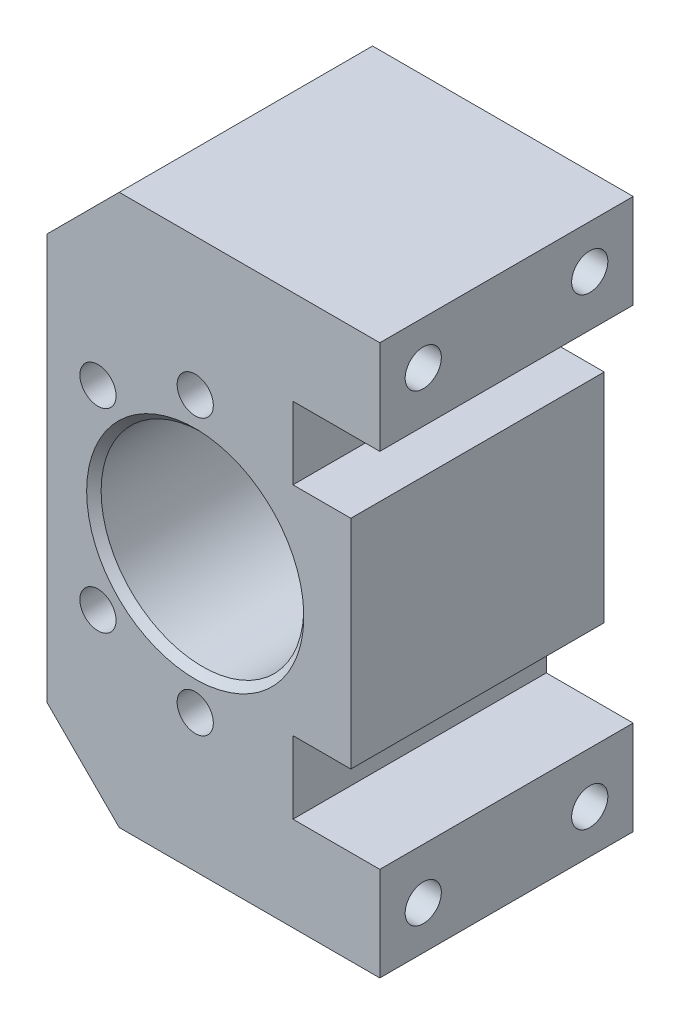
ISO-10303-21;
HEADER;
FILE_DESCRIPTION(('STEP AP214'),'2;1');
FILE_NAME('part.step','',(''),(''),'','','');
FILE_SCHEMA(('AUTOMOTIVE_DESIGN { 1 0 10303 214 1 1 1 1 }'));
ENDSEC;
DATA;
#1=APPLICATION_CONTEXT('core data for automotive mechanical design processes');
#2=APPLICATION_PROTOCOL_DEFINITION('international standard','automotive_design',2000,#1);
#3=PRODUCT_CONTEXT('',#1,'mechanical');
#4=PRODUCT('Part','Part','',(#3));
#5=PRODUCT_RELATED_PRODUCT_CATEGORY('part','',(#4));
#6=PRODUCT_DEFINITION_FORMATION('','',#4);
#7=PRODUCT_DEFINITION_CONTEXT('part definition',#1,'design');
#8=PRODUCT_DEFINITION('design','',#6,#7);
#9=PRODUCT_DEFINITION_SHAPE('','',#8);
#10=(LENGTH_UNIT() NAMED_UNIT(*) SI_UNIT(.MILLI.,.METRE.));
#11=(NAMED_UNIT(*) PLANE_ANGLE_UNIT() SI_UNIT($,.RADIAN.));
#12=(NAMED_UNIT(*) SI_UNIT($,.STERADIAN.) SOLID_ANGLE_UNIT());
#13=UNCERTAINTY_MEASURE_WITH_UNIT(LENGTH_MEASURE(1.E-05),#10,'distance_accuracy_value','');
#14=(GEOMETRIC_REPRESENTATION_CONTEXT(3) GLOBAL_UNCERTAINTY_ASSIGNED_CONTEXT((#13)) GLOBAL_UNIT_ASSIGNED_CONTEXT((#10,
#11,#12)) REPRESENTATION_CONTEXT('',''));
#15=CARTESIAN_POINT('',(0.,0.,0.));
#16=DIRECTION('',(0.,0.,1.));
#17=DIRECTION('',(1.,0.,0.));
#18=AXIS2_PLACEMENT_3D('',#15,#16,#17);
#19=CARTESIAN_POINT('',(46.,0.,35.));
#20=DIRECTION('',(-1.,0.,0.));
#21=DIRECTION('',(0.,0.,1.));
#22=AXIS2_PLACEMENT_3D('',#19,#20,#21);
#23=PLANE('',#22);
#24=CARTESIAN_POINT('',(46.,70.,6.));
#25=DIRECTION('',(1.,0.,0.));
#26=DIRECTION('',(0.,0.,-1.));
#27=AXIS2_PLACEMENT_3D('',#24,#25,#26);
#28=CIRCLE('',#27,2.49999999999999);
#29=CARTESIAN_POINT('',(46.,70.,3.50000000000001));
#30=VERTEX_POINT('',#29);
#31=EDGE_CURVE('E495',#30,#30,#28,.T.);
#32=ORIENTED_EDGE('',*,*,#31,.F.);
#33=EDGE_LOOP('',(#32));
#34=FACE_BOUND('',#33,.T.);
#35=CARTESIAN_POINT('',(46.,70.,29.));
#36=DIRECTION('',(1.,0.,0.));
#37=DIRECTION('',(0.,0.,-1.));
#38=AXIS2_PLACEMENT_3D('',#35,#36,#37);
#39=CIRCLE('',#38,2.49999999999999);
#40=CARTESIAN_POINT('',(46.,70.,26.5));
#41=VERTEX_POINT('',#40);
#42=EDGE_CURVE('E479',#41,#41,#39,.T.);
#43=ORIENTED_EDGE('',*,*,#42,.F.);
#44=EDGE_LOOP('',(#43));
#45=FACE_BOUND('',#44,.T.);
#46=DIRECTION('',(0.,1.,0.));
#47=VECTOR('',#46,1.);
#48=CARTESIAN_POINT('',(46.,0.,35.));
#49=LINE('',#48,#47);
#50=CARTESIAN_POINT('',(46.,63.,35.));
#51=VERTEX_POINT('',#50);
#52=CARTESIAN_POINT('',(46.,76.,35.));
#53=VERTEX_POINT('',#52);
#54=EDGE_CURVE('E172',#51,#53,#49,.T.);
#55=ORIENTED_EDGE('',*,*,#54,.F.);
#56=DIRECTION('',(0.,0.,-1.));
#57=VECTOR('',#56,1.);
#58=CARTESIAN_POINT('',(46.,63.,35.));
#59=LINE('',#58,#57);
#60=CARTESIAN_POINT('',(46.,63.,0.));
#61=VERTEX_POINT('',#60);
#62=EDGE_CURVE('E157',#51,#61,#59,.T.);
#63=ORIENTED_EDGE('',*,*,#62,.T.);
#64=DIRECTION('',(0.,1.,0.));
#65=VECTOR('',#64,1.);
#66=CARTESIAN_POINT('',(46.,0.,0.));
#67=LINE('',#66,#65);
#68=CARTESIAN_POINT('',(46.,76.,0.));
#69=VERTEX_POINT('',#68);
#70=EDGE_CURVE('E196',#61,#69,#67,.T.);
#71=ORIENTED_EDGE('',*,*,#70,.T.);
#72=DIRECTION('',(0.,0.,-1.));
#73=VECTOR('',#72,1.);
#74=CARTESIAN_POINT('',(46.,76.,35.));
#75=LINE('',#74,#73);
#76=EDGE_CURVE('E179',#53,#69,#75,.T.);
#77=ORIENTED_EDGE('',*,*,#76,.F.);
#78=EDGE_LOOP('',(#55,#63,#71,#77));
#79=FACE_BOUND('',#78,.T.);
#80=ADVANCED_FACE('F32',(#34,#45,#79),#23,.F.);
#81=CARTESIAN_POINT('',(0.,0.,35.));
#82=DIRECTION('',(0.,0.,-1.));
#83=DIRECTION('',(-1.,0.,0.));
#84=AXIS2_PLACEMENT_3D('',#81,#82,#83);
#85=PLANE('',#84);
#86=CARTESIAN_POINT('',(20.5,57.,35.));
#87=DIRECTION('',(0.,0.,1.));
#88=DIRECTION('',(1.,0.,0.));
#89=AXIS2_PLACEMENT_3D('',#86,#87,#88);
#90=CIRCLE('',#89,2.5);
#91=CARTESIAN_POINT('',(23.,57.,35.));
#92=VERTEX_POINT('',#91);
#93=EDGE_CURVE('E513',#92,#92,#90,.T.);
#94=ORIENTED_EDGE('',*,*,#93,.F.);
#95=EDGE_LOOP('',(#94));
#96=FACE_BOUND('',#95,.T.);
#97=CARTESIAN_POINT('',(7.06497115745557,51.4350288425443,35.));
#98=DIRECTION('',(0.,0.,1.));
#99=DIRECTION('',(1.,0.,0.));
#100=AXIS2_PLACEMENT_3D('',#97,#98,#99);
#101=CIRCLE('',#100,2.5);
#102=CARTESIAN_POINT('',(9.56497115745557,51.4350288425443,35.));
#103=VERTEX_POINT('',#102);
#104=EDGE_CURVE('E519',#103,#103,#101,.T.);
#105=ORIENTED_EDGE('',*,*,#104,.F.);
#106=EDGE_LOOP('',(#105));
#107=FACE_BOUND('',#106,.T.);
#108=CARTESIAN_POINT('',(7.06497115745557,24.5649711574556,35.));
#109=DIRECTION('',(0.,0.,1.));
#110=DIRECTION('',(1.,0.,0.));
#111=AXIS2_PLACEMENT_3D('',#108,#109,#110);
#112=CIRCLE('',#111,2.5);
#113=CARTESIAN_POINT('',(9.56497115745557,24.5649711574556,35.));
#114=VERTEX_POINT('',#113);
#115=EDGE_CURVE('E525',#114,#114,#112,.T.);
#116=ORIENTED_EDGE('',*,*,#115,.F.);
#117=EDGE_LOOP('',(#116));
#118=FACE_BOUND('',#117,.T.);
#119=CARTESIAN_POINT('',(20.5,19.,35.));
#120=DIRECTION('',(0.,0.,1.));
#121=DIRECTION('',(1.,0.,0.));
#122=AXIS2_PLACEMENT_3D('',#119,#120,#121);
#123=CIRCLE('',#122,2.5);
#124=CARTESIAN_POINT('',(23.,19.,35.));
#125=VERTEX_POINT('',#124);
#126=EDGE_CURVE('E531',#125,#125,#123,.T.);
#127=ORIENTED_EDGE('',*,*,#126,.F.);
#128=EDGE_LOOP('',(#127));
#129=FACE_BOUND('',#128,.T.);
#130=CARTESIAN_POINT('',(20.5,38.,35.));
#131=DIRECTION('',(0.,0.,-1.));
#132=DIRECTION('',(-1.,0.,0.));
#133=AXIS2_PLACEMENT_3D('',#130,#131,#132);
#134=CIRCLE('',#133,15.);
#135=CARTESIAN_POINT('',(5.49999999999998,38.,35.));
#136=VERTEX_POINT('',#135);
#137=EDGE_CURVE('E215',#136,#136,#134,.T.);
#138=ORIENTED_EDGE('',*,*,#137,.T.);
#139=EDGE_LOOP('',(#138));
#140=FACE_BOUND('',#139,.T.);
#141=DIRECTION('',(0.,1.,0.));
#142=VECTOR('',#141,1.);
#143=CARTESIAN_POINT('',(34.,63.,35.));
#144=LINE('',#143,#142);
#145=CARTESIAN_POINT('',(34.,53.,35.));
#146=VERTEX_POINT('',#145);
#147=CARTESIAN_POINT('',(34.,63.,35.));
#148=VERTEX_POINT('',#147);
#149=EDGE_CURVE('E168',#146,#148,#144,.T.);
#150=ORIENTED_EDGE('',*,*,#149,.T.);
#151=DIRECTION('',(1.,0.,0.));
#152=VECTOR('',#151,1.);
#153=CARTESIAN_POINT('',(46.,63.,35.));
#154=LINE('',#153,#152);
#155=EDGE_CURVE('E160',#148,#51,#154,.T.);
#156=ORIENTED_EDGE('',*,*,#155,.T.);
#157=ORIENTED_EDGE('',*,*,#54,.T.);
#158=DIRECTION('',(-1.,0.,0.));
#159=VECTOR('',#158,1.);
#160=CARTESIAN_POINT('',(0.,76.,35.));
#161=LINE('',#160,#159);
#162=CARTESIAN_POINT('',(10.,76.,35.));
#163=VERTEX_POINT('',#162);
#164=EDGE_CURVE('E184',#53,#163,#161,.T.);
#165=ORIENTED_EDGE('',*,*,#164,.T.);
#166=DIRECTION('',(0.707106781186548,0.707106781186547,0.));
#167=VECTOR('',#166,1.);
#168=CARTESIAN_POINT('',(0.,66.,35.));
#169=LINE('',#168,#167);
#170=CARTESIAN_POINT('',(0.,66.,35.));
#171=VERTEX_POINT('',#170);
#172=EDGE_CURVE('E230',#163,#171,#169,.F.);
#173=ORIENTED_EDGE('',*,*,#172,.T.);
#174=DIRECTION('',(0.,-1.,0.));
#175=VECTOR('',#174,1.);
#176=CARTESIAN_POINT('',(0.,0.,35.));
#177=LINE('',#176,#175);
#178=CARTESIAN_POINT('',(0.,10.,35.));
#179=VERTEX_POINT('',#178);
#180=EDGE_CURVE('E185',#171,#179,#177,.T.);
#181=ORIENTED_EDGE('',*,*,#180,.T.);
#182=DIRECTION('',(-0.707106781186546,0.707106781186549,0.));
#183=VECTOR('',#182,1.);
#184=CARTESIAN_POINT('',(9.99999999999998,0.,35.));
#185=LINE('',#184,#183);
#186=CARTESIAN_POINT('',(9.99999999999998,0.,35.));
#187=VERTEX_POINT('',#186);
#188=EDGE_CURVE('E40',#179,#187,#185,.F.);
#189=ORIENTED_EDGE('',*,*,#188,.T.);
#190=DIRECTION('',(1.,0.,0.));
#191=VECTOR('',#190,1.);
#192=CARTESIAN_POINT('',(0.,0.,35.));
#193=LINE('',#192,#191);
#194=CARTESIAN_POINT('',(46.,0.,35.));
#195=VERTEX_POINT('',#194);
#196=EDGE_CURVE('E181',#187,#195,#193,.T.);
#197=ORIENTED_EDGE('',*,*,#196,.T.);
#198=CARTESIAN_POINT('',(46.,13.,35.));
#199=VERTEX_POINT('',#198);
#200=EDGE_CURVE('E180',#195,#199,#49,.T.);
#201=ORIENTED_EDGE('',*,*,#200,.T.);
#202=DIRECTION('',(-1.,0.,0.));
#203=VECTOR('',#202,1.);
#204=CARTESIAN_POINT('',(34.,13.,35.));
#205=LINE('',#204,#203);
#206=CARTESIAN_POINT('',(34.,13.,35.));
#207=VERTEX_POINT('',#206);
#208=EDGE_CURVE('E47',#199,#207,#205,.T.);
#209=ORIENTED_EDGE('',*,*,#208,.T.);
#210=DIRECTION('',(0.,1.,0.));
#211=VECTOR('',#210,1.);
#212=CARTESIAN_POINT('',(34.,23.,35.));
#213=LINE('',#212,#211);
#214=CARTESIAN_POINT('',(34.,23.,35.));
#215=VERTEX_POINT('',#214);
#216=EDGE_CURVE('E567',#207,#215,#213,.T.);
#217=ORIENTED_EDGE('',*,*,#216,.T.);
#218=DIRECTION('',(1.,0.,0.));
#219=VECTOR('',#218,1.);
#220=CARTESIAN_POINT('',(42.,23.,35.));
#221=LINE('',#220,#219);
#222=CARTESIAN_POINT('',(42.,23.,35.));
#223=VERTEX_POINT('',#222);
#224=EDGE_CURVE('E569',#215,#223,#221,.T.);
#225=ORIENTED_EDGE('',*,*,#224,.T.);
#226=DIRECTION('',(0.,1.,0.));
#227=VECTOR('',#226,1.);
#228=CARTESIAN_POINT('',(42.,53.,35.));
#229=LINE('',#228,#227);
#230=CARTESIAN_POINT('',(42.,53.,35.));
#231=VERTEX_POINT('',#230);
#232=EDGE_CURVE('E573',#223,#231,#229,.T.);
#233=ORIENTED_EDGE('',*,*,#232,.T.);
#234=DIRECTION('',(-1.,0.,0.));
#235=VECTOR('',#234,1.);
#236=CARTESIAN_POINT('',(34.,53.,35.));
#237=LINE('',#236,#235);
#238=EDGE_CURVE('E576',#231,#146,#237,.T.);
#239=ORIENTED_EDGE('',*,*,#238,.T.);
#240=EDGE_LOOP('',(#150,#156,#157,#165,#173,#181,#189,#197,#201,#209,#217,#225,#233,#239));
#241=FACE_BOUND('',#240,.T.);
#242=ADVANCED_FACE('F171',(#96,#107,#118,#129,#140,#241),#85,.F.);
#243=CARTESIAN_POINT('',(0.,0.,0.));
#244=DIRECTION('',(0.,0.,-1.));
#245=DIRECTION('',(-1.,0.,0.));
#246=AXIS2_PLACEMENT_3D('',#243,#244,#245);
#247=PLANE('',#246);
#248=DIRECTION('',(1.,0.,0.));
#249=VECTOR('',#248,1.);
#250=CARTESIAN_POINT('',(46.,63.,0.));
#251=LINE('',#250,#249);
#252=CARTESIAN_POINT('',(34.,63.,0.));
#253=VERTEX_POINT('',#252);
#254=EDGE_CURVE('E163',#253,#61,#251,.T.);
#255=ORIENTED_EDGE('',*,*,#254,.F.);
#256=DIRECTION('',(0.,1.,0.));
#257=VECTOR('',#256,1.);
#258=CARTESIAN_POINT('',(34.,63.,0.));
#259=LINE('',#258,#257);
#260=CARTESIAN_POINT('',(34.,53.,0.));
#261=VERTEX_POINT('',#260);
#262=EDGE_CURVE('E176',#261,#253,#259,.T.);
#263=ORIENTED_EDGE('',*,*,#262,.F.);
#264=DIRECTION('',(-1.,0.,0.));
#265=VECTOR('',#264,1.);
#266=CARTESIAN_POINT('',(34.,53.,0.));
#267=LINE('',#266,#265);
#268=CARTESIAN_POINT('',(42.,53.,0.));
#269=VERTEX_POINT('',#268);
#270=EDGE_CURVE('E472',#269,#261,#267,.T.);
#271=ORIENTED_EDGE('',*,*,#270,.F.);
#272=DIRECTION('',(0.,1.,0.));
#273=VECTOR('',#272,1.);
#274=CARTESIAN_POINT('',(42.,53.,0.));
#275=LINE('',#274,#273);
#276=CARTESIAN_POINT('',(42.,23.,0.));
#277=VERTEX_POINT('',#276);
#278=EDGE_CURVE('E466',#277,#269,#275,.T.);
#279=ORIENTED_EDGE('',*,*,#278,.F.);
#280=DIRECTION('',(1.,0.,0.));
#281=VECTOR('',#280,1.);
#282=CARTESIAN_POINT('',(42.,23.,0.));
#283=LINE('',#282,#281);
#284=CARTESIAN_POINT('',(34.,23.,0.));
#285=VERTEX_POINT('',#284);
#286=EDGE_CURVE('E464',#285,#277,#283,.T.);
#287=ORIENTED_EDGE('',*,*,#286,.F.);
#288=DIRECTION('',(0.,1.,0.));
#289=VECTOR('',#288,1.);
#290=CARTESIAN_POINT('',(34.,23.,0.));
#291=LINE('',#290,#289);
#292=CARTESIAN_POINT('',(34.,13.,0.));
#293=VERTEX_POINT('',#292);
#294=EDGE_CURVE('E458',#293,#285,#291,.T.);
#295=ORIENTED_EDGE('',*,*,#294,.F.);
#296=DIRECTION('',(-1.,0.,0.));
#297=VECTOR('',#296,1.);
#298=CARTESIAN_POINT('',(34.,13.,0.));
#299=LINE('',#298,#297);
#300=CARTESIAN_POINT('',(46.,13.,0.));
#301=VERTEX_POINT('',#300);
#302=EDGE_CURVE('E454',#301,#293,#299,.T.);
#303=ORIENTED_EDGE('',*,*,#302,.F.);
#304=CARTESIAN_POINT('',(46.,0.,0.));
#305=VERTEX_POINT('',#304);
#306=EDGE_CURVE('E197',#305,#301,#67,.T.);
#307=ORIENTED_EDGE('',*,*,#306,.F.);
#308=DIRECTION('',(1.,0.,0.));
#309=VECTOR('',#308,1.);
#310=CARTESIAN_POINT('',(0.,0.,0.));
#311=LINE('',#310,#309);
#312=CARTESIAN_POINT('',(9.99999999999998,0.,0.));
#313=VERTEX_POINT('',#312);
#314=EDGE_CURVE('E193',#313,#305,#311,.T.);
#315=ORIENTED_EDGE('',*,*,#314,.F.);
#316=DIRECTION('',(0.707106781186546,-0.707106781186549,0.));
#317=VECTOR('',#316,1.);
#318=CARTESIAN_POINT('',(5.00000000000001,4.99999999999999,0.));
#319=LINE('',#318,#317);
#320=CARTESIAN_POINT('',(0.,10.,0.));
#321=VERTEX_POINT('',#320);
#322=EDGE_CURVE('E223',#313,#321,#319,.F.);
#323=ORIENTED_EDGE('',*,*,#322,.T.);
#324=DIRECTION('',(0.,-1.,0.));
#325=VECTOR('',#324,1.);
#326=CARTESIAN_POINT('',(0.,0.,0.));
#327=LINE('',#326,#325);
#328=CARTESIAN_POINT('',(0.,66.,0.));
#329=VERTEX_POINT('',#328);
#330=EDGE_CURVE('E190',#329,#321,#327,.T.);
#331=ORIENTED_EDGE('',*,*,#330,.F.);
#332=DIRECTION('',(-0.707106781186548,-0.707106781186547,0.));
#333=VECTOR('',#332,1.);
#334=CARTESIAN_POINT('',(-33.,33.,0.));
#335=LINE('',#334,#333);
#336=CARTESIAN_POINT('',(10.,76.,0.));
#337=VERTEX_POINT('',#336);
#338=EDGE_CURVE('E221',#329,#337,#335,.F.);
#339=ORIENTED_EDGE('',*,*,#338,.T.);
#340=DIRECTION('',(-1.,0.,0.));
#341=VECTOR('',#340,1.);
#342=CARTESIAN_POINT('',(0.,76.,0.));
#343=LINE('',#342,#341);
#344=EDGE_CURVE('E200',#69,#337,#343,.T.);
#345=ORIENTED_EDGE('',*,*,#344,.F.);
#346=ORIENTED_EDGE('',*,*,#70,.F.);
#347=EDGE_LOOP('',(#255,#263,#271,#279,#287,#295,#303,#307,#315,#323,#331,#339,#345,#346));
#348=FACE_BOUND('',#347,.T.);
#349=CARTESIAN_POINT('',(20.5,38.,0.));
#350=DIRECTION('',(0.,0.,-1.));
#351=DIRECTION('',(-1.,0.,0.));
#352=AXIS2_PLACEMENT_3D('',#349,#350,#351);
#353=CIRCLE('',#352,15.);
#354=CARTESIAN_POINT('',(5.49999999999998,38.,0.));
#355=VERTEX_POINT('',#354);
#356=EDGE_CURVE('E206',#355,#355,#353,.F.);
#357=ORIENTED_EDGE('',*,*,#356,.T.);
#358=EDGE_LOOP('',(#357));
#359=FACE_BOUND('',#358,.T.);
#360=ADVANCED_FACE('F246',(#348,#359),#247,.T.);
#361=CARTESIAN_POINT('',(0.,0.,35.));
#362=DIRECTION('',(1.,0.,0.));
#363=DIRECTION('',(0.,1.,0.));
#364=AXIS2_PLACEMENT_3D('',#361,#362,#363);
#365=PLANE('',#364);
#366=ORIENTED_EDGE('',*,*,#330,.T.);
#367=DIRECTION('',(0.,0.,1.));
#368=VECTOR('',#367,1.);
#369=CARTESIAN_POINT('',(0.,10.,35.));
#370=LINE('',#369,#368);
#371=EDGE_CURVE('E228',#321,#179,#370,.T.);
#372=ORIENTED_EDGE('',*,*,#371,.T.);
#373=ORIENTED_EDGE('',*,*,#180,.F.);
#374=DIRECTION('',(0.,0.,-1.));
#375=VECTOR('',#374,1.);
#376=CARTESIAN_POINT('',(0.,66.,35.));
#377=LINE('',#376,#375);
#378=EDGE_CURVE('E225',#171,#329,#377,.T.);
#379=ORIENTED_EDGE('',*,*,#378,.T.);
#380=EDGE_LOOP('',(#366,#372,#373,#379));
#381=FACE_BOUND('',#380,.T.);
#382=ADVANCED_FACE('F250',(#381),#365,.F.);
#383=CARTESIAN_POINT('',(0.,0.,35.));
#384=DIRECTION('',(0.,1.,0.));
#385=DIRECTION('',(0.,0.,1.));
#386=AXIS2_PLACEMENT_3D('',#383,#384,#385);
#387=PLANE('',#386);
#388=ORIENTED_EDGE('',*,*,#196,.F.);
#389=DIRECTION('',(0.,0.,-1.));
#390=VECTOR('',#389,1.);
#391=CARTESIAN_POINT('',(9.99999999999998,0.,35.));
#392=LINE('',#391,#390);
#393=EDGE_CURVE('E218',#187,#313,#392,.T.);
#394=ORIENTED_EDGE('',*,*,#393,.T.);
#395=ORIENTED_EDGE('',*,*,#314,.T.);
#396=DIRECTION('',(0.,0.,-1.));
#397=VECTOR('',#396,1.);
#398=CARTESIAN_POINT('',(46.,0.,35.));
#399=LINE('',#398,#397);
#400=EDGE_CURVE('E203',#195,#305,#399,.T.);
#401=ORIENTED_EDGE('',*,*,#400,.F.);
#402=EDGE_LOOP('',(#388,#394,#395,#401));
#403=FACE_BOUND('',#402,.T.);
#404=ADVANCED_FACE('F240',(#403),#387,.F.);
#405=CARTESIAN_POINT('',(46.,6.,6.));
#406=DIRECTION('',(1.,0.,0.));
#407=DIRECTION('',(0.,0.,-1.));
#408=AXIS2_PLACEMENT_3D('',#405,#406,#407);
#409=CIRCLE('',#408,2.49999999999999);
#410=CARTESIAN_POINT('',(46.,6.,3.50000000000001));
#411=VERTEX_POINT('',#410);
#412=EDGE_CURVE('E501',#411,#411,#409,.T.);
#413=ORIENTED_EDGE('',*,*,#412,.F.);
#414=EDGE_LOOP('',(#413));
#415=FACE_BOUND('',#414,.T.);
#416=CARTESIAN_POINT('',(46.,6.,29.));
#417=DIRECTION('',(1.,0.,0.));
#418=DIRECTION('',(0.,0.,-1.));
#419=AXIS2_PLACEMENT_3D('',#416,#417,#418);
#420=CIRCLE('',#419,2.49999999999999);
#421=CARTESIAN_POINT('',(46.,6.,26.5));
#422=VERTEX_POINT('',#421);
#423=EDGE_CURVE('E507',#422,#422,#420,.T.);
#424=ORIENTED_EDGE('',*,*,#423,.F.);
#425=EDGE_LOOP('',(#424));
#426=FACE_BOUND('',#425,.T.);
#427=ORIENTED_EDGE('',*,*,#306,.T.);
#428=DIRECTION('',(0.,0.,-1.));
#429=VECTOR('',#428,1.);
#430=CARTESIAN_POINT('',(46.,13.,35.));
#431=LINE('',#430,#429);
#432=EDGE_CURVE('E167',#199,#301,#431,.T.);
#433=ORIENTED_EDGE('',*,*,#432,.F.);
#434=ORIENTED_EDGE('',*,*,#200,.F.);
#435=ORIENTED_EDGE('',*,*,#400,.T.);
#436=EDGE_LOOP('',(#427,#433,#434,#435));
#437=FACE_BOUND('',#436,.T.);
#438=ADVANCED_FACE('F258',(#415,#426,#437),#23,.F.);
#439=CARTESIAN_POINT('',(0.,76.,35.));
#440=DIRECTION('',(0.,-1.,0.));
#441=DIRECTION('',(1.,0.,0.));
#442=AXIS2_PLACEMENT_3D('',#439,#440,#441);
#443=PLANE('',#442);
#444=ORIENTED_EDGE('',*,*,#344,.T.);
#445=DIRECTION('',(0.,0.,1.));
#446=VECTOR('',#445,1.);
#447=CARTESIAN_POINT('',(10.,76.,35.));
#448=LINE('',#447,#446);
#449=EDGE_CURVE('E11',#337,#163,#448,.T.);
#450=ORIENTED_EDGE('',*,*,#449,.T.);
#451=ORIENTED_EDGE('',*,*,#164,.F.);
#452=ORIENTED_EDGE('',*,*,#76,.T.);
#453=EDGE_LOOP('',(#444,#450,#451,#452));
#454=FACE_BOUND('',#453,.T.);
#455=ADVANCED_FACE('F255',(#454),#443,.F.);
#456=CARTESIAN_POINT('',(20.5,38.,35.));
#457=DIRECTION('',(0.,0.,-1.));
#458=DIRECTION('',(-1.,0.,0.));
#459=AXIS2_PLACEMENT_3D('',#456,#457,#458);
#460=CYLINDRICAL_SURFACE('',#459,14.);
#461=CARTESIAN_POINT('',(20.5,38.,1.00000000000001));
#462=DIRECTION('',(0.,0.,-1.));
#463=DIRECTION('',(-1.,0.,0.));
#464=AXIS2_PLACEMENT_3D('',#461,#462,#463);
#465=CIRCLE('',#464,14.);
#466=CARTESIAN_POINT('',(6.49999999999998,38.,1.00000000000001));
#467=VERTEX_POINT('',#466);
#468=EDGE_CURVE('E212',#467,#467,#465,.T.);
#469=ORIENTED_EDGE('',*,*,#468,.T.);
#470=EDGE_LOOP('',(#469));
#471=FACE_BOUND('',#470,.T.);
#472=CARTESIAN_POINT('',(20.5,38.,34.));
#473=DIRECTION('',(0.,0.,-1.));
#474=DIRECTION('',(-1.,0.,0.));
#475=AXIS2_PLACEMENT_3D('',#472,#473,#474);
#476=CIRCLE('',#475,14.);
#477=CARTESIAN_POINT('',(6.49999999999998,38.,34.));
#478=VERTEX_POINT('',#477);
#479=EDGE_CURVE('E209',#478,#478,#476,.F.);
#480=ORIENTED_EDGE('',*,*,#479,.T.);
#481=EDGE_LOOP('',(#480));
#482=FACE_BOUND('',#481,.T.);
#483=ADVANCED_FACE('F257',(#471,#482),#460,.F.);
#484=CARTESIAN_POINT('',(20.5,38.,0.));
#485=DIRECTION('',(0.,0.,-1.));
#486=DIRECTION('',(-1.,0.,0.));
#487=AXIS2_PLACEMENT_3D('',#484,#485,#486);
#488=CONICAL_SURFACE('',#487,15.,0.785398163397449);
#489=ORIENTED_EDGE('',*,*,#468,.F.);
#490=EDGE_LOOP('',(#489));
#491=FACE_BOUND('',#490,.T.);
#492=ORIENTED_EDGE('',*,*,#356,.F.);
#493=EDGE_LOOP('',(#492));
#494=FACE_BOUND('',#493,.T.);
#495=ADVANCED_FACE('F264',(#491,#494),#488,.F.);
#496=CARTESIAN_POINT('',(20.5,38.,34.));
#497=DIRECTION('',(0.,0.,1.));
#498=DIRECTION('',(1.,0.,0.));
#499=AXIS2_PLACEMENT_3D('',#496,#497,#498);
#500=CONICAL_SURFACE('',#499,14.,0.785398163397453);
#501=ORIENTED_EDGE('',*,*,#137,.F.);
#502=EDGE_LOOP('',(#501));
#503=FACE_BOUND('',#502,.T.);
#504=ORIENTED_EDGE('',*,*,#479,.F.);
#505=EDGE_LOOP('',(#504));
#506=FACE_BOUND('',#505,.T.);
#507=ADVANCED_FACE('F286',(#503,#506),#500,.F.);
#508=CARTESIAN_POINT('',(20.5,19.,18.));
#509=DIRECTION('',(0.,0.,1.));
#510=DIRECTION('',(1.,0.,0.));
#511=AXIS2_PLACEMENT_3D('',#508,#509,#510);
#512=CONICAL_SURFACE('',#511,2.5,1.02974425867665);
#513=CARTESIAN_POINT('',(20.5,19.,16.4978484524311));
#514=VERTEX_POINT('',#513);
#515=VERTEX_LOOP('',#514);
#516=FACE_BOUND('',#515,.T.);
#517=CARTESIAN_POINT('',(20.5,19.,18.));
#518=DIRECTION('',(0.,0.,1.));
#519=DIRECTION('',(1.,0.,0.));
#520=AXIS2_PLACEMENT_3D('',#517,#518,#519);
#521=CIRCLE('',#520,2.5);
#522=CARTESIAN_POINT('',(23.,19.,18.));
#523=VERTEX_POINT('',#522);
#524=EDGE_CURVE('E194',#523,#523,#521,.T.);
#525=ORIENTED_EDGE('',*,*,#524,.T.);
#526=EDGE_LOOP('',(#525));
#527=FACE_BOUND('',#526,.T.);
#528=ADVANCED_FACE('F289',(#516,#527),#512,.F.);
#529=CARTESIAN_POINT('',(20.5,19.,35.));
#530=DIRECTION('',(0.,0.,1.));
#531=DIRECTION('',(1.,0.,0.));
#532=AXIS2_PLACEMENT_3D('',#529,#530,#531);
#533=CYLINDRICAL_SURFACE('',#532,2.5);
#534=ORIENTED_EDGE('',*,*,#524,.F.);
#535=EDGE_LOOP('',(#534));
#536=FACE_BOUND('',#535,.T.);
#537=ORIENTED_EDGE('',*,*,#126,.T.);
#538=EDGE_LOOP('',(#537));
#539=FACE_BOUND('',#538,.T.);
#540=ADVANCED_FACE('F357',(#536,#539),#533,.F.);
#541=CARTESIAN_POINT('',(7.06497115745557,24.5649711574556,18.));
#542=DIRECTION('',(0.,0.,1.));
#543=DIRECTION('',(1.,0.,0.));
#544=AXIS2_PLACEMENT_3D('',#541,#542,#543);
#545=CONICAL_SURFACE('',#544,2.5,1.02974425867665);
#546=CARTESIAN_POINT('',(7.06497115745557,24.5649711574556,16.4978484524311));
#547=VERTEX_POINT('',#546);
#548=VERTEX_LOOP('',#547);
#549=FACE_BOUND('',#548,.T.);
#550=CARTESIAN_POINT('',(7.06497115745557,24.5649711574556,18.));
#551=DIRECTION('',(0.,0.,1.));
#552=DIRECTION('',(1.,0.,0.));
#553=AXIS2_PLACEMENT_3D('',#550,#551,#552);
#554=CIRCLE('',#553,2.5);
#555=CARTESIAN_POINT('',(9.56497115745557,24.5649711574556,18.));
#556=VERTEX_POINT('',#555);
#557=EDGE_CURVE('E528',#556,#556,#554,.T.);
#558=ORIENTED_EDGE('',*,*,#557,.T.);
#559=EDGE_LOOP('',(#558));
#560=FACE_BOUND('',#559,.T.);
#561=ADVANCED_FACE('F353',(#549,#560),#545,.F.);
#562=CARTESIAN_POINT('',(7.06497115745557,24.5649711574556,35.));
#563=DIRECTION('',(0.,0.,1.));
#564=DIRECTION('',(1.,0.,0.));
#565=AXIS2_PLACEMENT_3D('',#562,#563,#564);
#566=CYLINDRICAL_SURFACE('',#565,2.5);
#567=ORIENTED_EDGE('',*,*,#557,.F.);
#568=EDGE_LOOP('',(#567));
#569=FACE_BOUND('',#568,.T.);
#570=ORIENTED_EDGE('',*,*,#115,.T.);
#571=EDGE_LOOP('',(#570));
#572=FACE_BOUND('',#571,.T.);
#573=ADVANCED_FACE('F349',(#569,#572),#566,.F.);
#574=CARTESIAN_POINT('',(7.06497115745557,51.4350288425443,18.));
#575=DIRECTION('',(0.,0.,1.));
#576=DIRECTION('',(1.,0.,0.));
#577=AXIS2_PLACEMENT_3D('',#574,#575,#576);
#578=CONICAL_SURFACE('',#577,2.5,1.02974425867665);
#579=CARTESIAN_POINT('',(7.06497115745557,51.4350288425443,16.4978484524311));
#580=VERTEX_POINT('',#579);
#581=VERTEX_LOOP('',#580);
#582=FACE_BOUND('',#581,.T.);
#583=CARTESIAN_POINT('',(7.06497115745557,51.4350288425443,18.));
#584=DIRECTION('',(0.,0.,1.));
#585=DIRECTION('',(1.,0.,0.));
#586=AXIS2_PLACEMENT_3D('',#583,#584,#585);
#587=CIRCLE('',#586,2.5);
#588=CARTESIAN_POINT('',(9.56497115745557,51.4350288425443,18.));
#589=VERTEX_POINT('',#588);
#590=EDGE_CURVE('E522',#589,#589,#587,.T.);
#591=ORIENTED_EDGE('',*,*,#590,.T.);
#592=EDGE_LOOP('',(#591));
#593=FACE_BOUND('',#592,.T.);
#594=ADVANCED_FACE('F345',(#582,#593),#578,.F.);
#595=CARTESIAN_POINT('',(7.06497115745557,51.4350288425443,35.));
#596=DIRECTION('',(0.,0.,1.));
#597=DIRECTION('',(1.,0.,0.));
#598=AXIS2_PLACEMENT_3D('',#595,#596,#597);
#599=CYLINDRICAL_SURFACE('',#598,2.5);
#600=ORIENTED_EDGE('',*,*,#590,.F.);
#601=EDGE_LOOP('',(#600));
#602=FACE_BOUND('',#601,.T.);
#603=ORIENTED_EDGE('',*,*,#104,.T.);
#604=EDGE_LOOP('',(#603));
#605=FACE_BOUND('',#604,.T.);
#606=ADVANCED_FACE('F341',(#602,#605),#599,.F.);
#607=CARTESIAN_POINT('',(20.5,57.,18.));
#608=DIRECTION('',(0.,0.,1.));
#609=DIRECTION('',(1.,0.,0.));
#610=AXIS2_PLACEMENT_3D('',#607,#608,#609);
#611=CONICAL_SURFACE('',#610,2.5,1.02974425867665);
#612=CARTESIAN_POINT('',(20.5,57.,16.4978484524311));
#613=VERTEX_POINT('',#612);
#614=VERTEX_LOOP('',#613);
#615=FACE_BOUND('',#614,.T.);
#616=CARTESIAN_POINT('',(20.5,57.,18.));
#617=DIRECTION('',(0.,0.,1.));
#618=DIRECTION('',(1.,0.,0.));
#619=AXIS2_PLACEMENT_3D('',#616,#617,#618);
#620=CIRCLE('',#619,2.5);
#621=CARTESIAN_POINT('',(23.,57.,18.));
#622=VERTEX_POINT('',#621);
#623=EDGE_CURVE('E516',#622,#622,#620,.T.);
#624=ORIENTED_EDGE('',*,*,#623,.T.);
#625=EDGE_LOOP('',(#624));
#626=FACE_BOUND('',#625,.T.);
#627=ADVANCED_FACE('F337',(#615,#626),#611,.F.);
#628=CARTESIAN_POINT('',(20.5,57.,35.));
#629=DIRECTION('',(0.,0.,1.));
#630=DIRECTION('',(1.,0.,0.));
#631=AXIS2_PLACEMENT_3D('',#628,#629,#630);
#632=CYLINDRICAL_SURFACE('',#631,2.5);
#633=ORIENTED_EDGE('',*,*,#623,.F.);
#634=EDGE_LOOP('',(#633));
#635=FACE_BOUND('',#634,.T.);
#636=ORIENTED_EDGE('',*,*,#93,.T.);
#637=EDGE_LOOP('',(#636));
#638=FACE_BOUND('',#637,.T.);
#639=ADVANCED_FACE('F333',(#635,#638),#632,.F.);
#640=CARTESIAN_POINT('',(29.,6.,29.));
#641=DIRECTION('',(1.,0.,0.));
#642=DIRECTION('',(0.,0.,-1.));
#643=AXIS2_PLACEMENT_3D('',#640,#641,#642);
#644=CONICAL_SURFACE('',#643,2.49999999999999,1.02974425867665);
#645=CARTESIAN_POINT('',(27.4978484524311,5.99999999999999,29.));
#646=VERTEX_POINT('',#645);
#647=VERTEX_LOOP('',#646);
#648=FACE_BOUND('',#647,.T.);
#649=CARTESIAN_POINT('',(29.,6.,29.));
#650=DIRECTION('',(1.,0.,0.));
#651=DIRECTION('',(0.,0.,-1.));
#652=AXIS2_PLACEMENT_3D('',#649,#650,#651);
#653=CIRCLE('',#652,2.49999999999999);
#654=CARTESIAN_POINT('',(29.,6.,26.5));
#655=VERTEX_POINT('',#654);
#656=EDGE_CURVE('E510',#655,#655,#653,.T.);
#657=ORIENTED_EDGE('',*,*,#656,.T.);
#658=EDGE_LOOP('',(#657));
#659=FACE_BOUND('',#658,.T.);
#660=ADVANCED_FACE('F329',(#648,#659),#644,.F.);
#661=CARTESIAN_POINT('',(46.,6.,29.));
#662=DIRECTION('',(1.,0.,0.));
#663=DIRECTION('',(0.,0.,-1.));
#664=AXIS2_PLACEMENT_3D('',#661,#662,#663);
#665=CYLINDRICAL_SURFACE('',#664,2.49999999999999);
#666=ORIENTED_EDGE('',*,*,#656,.F.);
#667=EDGE_LOOP('',(#666));
#668=FACE_BOUND('',#667,.T.);
#669=ORIENTED_EDGE('',*,*,#423,.T.);
#670=EDGE_LOOP('',(#669));
#671=FACE_BOUND('',#670,.T.);
#672=ADVANCED_FACE('F325',(#668,#671),#665,.F.);
#673=CARTESIAN_POINT('',(29.,6.,6.));
#674=DIRECTION('',(1.,0.,0.));
#675=DIRECTION('',(0.,0.,-1.));
#676=AXIS2_PLACEMENT_3D('',#673,#674,#675);
#677=CONICAL_SURFACE('',#676,2.49999999999999,1.02974425867665);
#678=CARTESIAN_POINT('',(27.4978484524311,6.,6.));
#679=VERTEX_POINT('',#678);
#680=VERTEX_LOOP('',#679);
#681=FACE_BOUND('',#680,.T.);
#682=CARTESIAN_POINT('',(29.,6.,6.));
#683=DIRECTION('',(1.,0.,0.));
#684=DIRECTION('',(0.,0.,-1.));
#685=AXIS2_PLACEMENT_3D('',#682,#683,#684);
#686=CIRCLE('',#685,2.49999999999999);
#687=CARTESIAN_POINT('',(29.,6.,3.50000000000001));
#688=VERTEX_POINT('',#687);
#689=EDGE_CURVE('E504',#688,#688,#686,.T.);
#690=ORIENTED_EDGE('',*,*,#689,.T.);
#691=EDGE_LOOP('',(#690));
#692=FACE_BOUND('',#691,.T.);
#693=ADVANCED_FACE('F321',(#681,#692),#677,.F.);
#694=CARTESIAN_POINT('',(46.,6.,6.));
#695=DIRECTION('',(1.,0.,0.));
#696=DIRECTION('',(0.,0.,-1.));
#697=AXIS2_PLACEMENT_3D('',#694,#695,#696);
#698=CYLINDRICAL_SURFACE('',#697,2.49999999999999);
#699=ORIENTED_EDGE('',*,*,#689,.F.);
#700=EDGE_LOOP('',(#699));
#701=FACE_BOUND('',#700,.T.);
#702=ORIENTED_EDGE('',*,*,#412,.T.);
#703=EDGE_LOOP('',(#702));
#704=FACE_BOUND('',#703,.T.);
#705=ADVANCED_FACE('F317',(#701,#704),#698,.F.);
#706=CARTESIAN_POINT('',(29.,70.,6.));
#707=DIRECTION('',(1.,0.,0.));
#708=DIRECTION('',(0.,0.,-1.));
#709=AXIS2_PLACEMENT_3D('',#706,#707,#708);
#710=CONICAL_SURFACE('',#709,2.49999999999999,1.02974425867665);
#711=CARTESIAN_POINT('',(27.4978484524311,70.,6.));
#712=VERTEX_POINT('',#711);
#713=VERTEX_LOOP('',#712);
#714=FACE_BOUND('',#713,.T.);
#715=CARTESIAN_POINT('',(29.,70.,6.));
#716=DIRECTION('',(1.,0.,0.));
#717=DIRECTION('',(0.,0.,-1.));
#718=AXIS2_PLACEMENT_3D('',#715,#716,#717);
#719=CIRCLE('',#718,2.49999999999999);
#720=CARTESIAN_POINT('',(29.,70.,3.50000000000001));
#721=VERTEX_POINT('',#720);
#722=EDGE_CURVE('E498',#721,#721,#719,.T.);
#723=ORIENTED_EDGE('',*,*,#722,.T.);
#724=EDGE_LOOP('',(#723));
#725=FACE_BOUND('',#724,.T.);
#726=ADVANCED_FACE('F313',(#714,#725),#710,.F.);
#727=CARTESIAN_POINT('',(46.,70.,6.));
#728=DIRECTION('',(1.,0.,0.));
#729=DIRECTION('',(0.,0.,-1.));
#730=AXIS2_PLACEMENT_3D('',#727,#728,#729);
#731=CYLINDRICAL_SURFACE('',#730,2.49999999999999);
#732=ORIENTED_EDGE('',*,*,#722,.F.);
#733=EDGE_LOOP('',(#732));
#734=FACE_BOUND('',#733,.T.);
#735=ORIENTED_EDGE('',*,*,#31,.T.);
#736=EDGE_LOOP('',(#735));
#737=FACE_BOUND('',#736,.T.);
#738=ADVANCED_FACE('F303',(#734,#737),#731,.F.);
#739=CARTESIAN_POINT('',(29.,70.,29.));
#740=DIRECTION('',(1.,0.,0.));
#741=DIRECTION('',(0.,0.,-1.));
#742=AXIS2_PLACEMENT_3D('',#739,#740,#741);
#743=CONICAL_SURFACE('',#742,2.49999999999999,1.02974425867665);
#744=CARTESIAN_POINT('',(27.4978484524311,70.,29.));
#745=VERTEX_POINT('',#744);
#746=VERTEX_LOOP('',#745);
#747=FACE_BOUND('',#746,.T.);
#748=CARTESIAN_POINT('',(29.,70.,29.));
#749=DIRECTION('',(1.,0.,0.));
#750=DIRECTION('',(0.,0.,-1.));
#751=AXIS2_PLACEMENT_3D('',#748,#749,#750);
#752=CIRCLE('',#751,2.49999999999999);
#753=CARTESIAN_POINT('',(29.,70.,26.5));
#754=VERTEX_POINT('',#753);
#755=EDGE_CURVE('E492',#754,#754,#752,.T.);
#756=ORIENTED_EDGE('',*,*,#755,.T.);
#757=EDGE_LOOP('',(#756));
#758=FACE_BOUND('',#757,.T.);
#759=ADVANCED_FACE('F297',(#747,#758),#743,.F.);
#760=CARTESIAN_POINT('',(46.,70.,29.));
#761=DIRECTION('',(1.,0.,0.));
#762=DIRECTION('',(0.,0.,-1.));
#763=AXIS2_PLACEMENT_3D('',#760,#761,#762);
#764=CYLINDRICAL_SURFACE('',#763,2.49999999999999);
#765=ORIENTED_EDGE('',*,*,#755,.F.);
#766=EDGE_LOOP('',(#765));
#767=FACE_BOUND('',#766,.T.);
#768=ORIENTED_EDGE('',*,*,#42,.T.);
#769=EDGE_LOOP('',(#768));
#770=FACE_BOUND('',#769,.T.);
#771=ADVANCED_FACE('F292',(#767,#770),#764,.F.);
#772=CARTESIAN_POINT('',(9.99999999999998,0.,35.));
#773=DIRECTION('',(0.707106781186549,0.707106781186546,0.));
#774=DIRECTION('',(0.,0.,-1.));
#775=AXIS2_PLACEMENT_3D('',#772,#773,#774);
#776=PLANE('',#775);
#777=ORIENTED_EDGE('',*,*,#188,.F.);
#778=ORIENTED_EDGE('',*,*,#371,.F.);
#779=ORIENTED_EDGE('',*,*,#322,.F.);
#780=ORIENTED_EDGE('',*,*,#393,.F.);
#781=EDGE_LOOP('',(#777,#778,#779,#780));
#782=FACE_BOUND('',#781,.T.);
#783=ADVANCED_FACE('F243',(#782),#776,.F.);
#784=CARTESIAN_POINT('',(0.,66.,35.));
#785=DIRECTION('',(0.707106781186547,-0.707106781186548,0.));
#786=DIRECTION('',(0.,0.,-1.));
#787=AXIS2_PLACEMENT_3D('',#784,#785,#786);
#788=PLANE('',#787);
#789=ORIENTED_EDGE('',*,*,#172,.F.);
#790=ORIENTED_EDGE('',*,*,#449,.F.);
#791=ORIENTED_EDGE('',*,*,#338,.F.);
#792=ORIENTED_EDGE('',*,*,#378,.F.);
#793=EDGE_LOOP('',(#789,#790,#791,#792));
#794=FACE_BOUND('',#793,.T.);
#795=ADVANCED_FACE('F34',(#794),#788,.F.);
#796=CARTESIAN_POINT('',(46.,63.,35.));
#797=DIRECTION('',(0.,1.,0.));
#798=DIRECTION('',(0.,0.,1.));
#799=AXIS2_PLACEMENT_3D('',#796,#797,#798);
#800=PLANE('',#799);
#801=ORIENTED_EDGE('',*,*,#254,.T.);
#802=ORIENTED_EDGE('',*,*,#62,.F.);
#803=ORIENTED_EDGE('',*,*,#155,.F.);
#804=DIRECTION('',(0.,0.,-1.));
#805=VECTOR('',#804,1.);
#806=CARTESIAN_POINT('',(34.,63.,35.));
#807=LINE('',#806,#805);
#808=EDGE_CURVE('E477',#148,#253,#807,.T.);
#809=ORIENTED_EDGE('',*,*,#808,.T.);
#810=EDGE_LOOP('',(#801,#802,#803,#809));
#811=FACE_BOUND('',#810,.T.);
#812=ADVANCED_FACE('F159',(#811),#800,.F.);
#813=CARTESIAN_POINT('',(34.,63.,35.));
#814=DIRECTION('',(-1.,0.,0.));
#815=DIRECTION('',(0.,0.,1.));
#816=AXIS2_PLACEMENT_3D('',#813,#814,#815);
#817=PLANE('',#816);
#818=ORIENTED_EDGE('',*,*,#262,.T.);
#819=ORIENTED_EDGE('',*,*,#808,.F.);
#820=ORIENTED_EDGE('',*,*,#149,.F.);
#821=DIRECTION('',(0.,0.,-1.));
#822=VECTOR('',#821,1.);
#823=CARTESIAN_POINT('',(34.,53.,35.));
#824=LINE('',#823,#822);
#825=EDGE_CURVE('E480',#146,#261,#824,.T.);
#826=ORIENTED_EDGE('',*,*,#825,.T.);
#827=EDGE_LOOP('',(#818,#819,#820,#826));
#828=FACE_BOUND('',#827,.T.);
#829=ADVANCED_FACE('F391',(#828),#817,.F.);
#830=CARTESIAN_POINT('',(34.,53.,35.));
#831=DIRECTION('',(0.,-1.,0.));
#832=DIRECTION('',(0.,0.,-1.));
#833=AXIS2_PLACEMENT_3D('',#830,#831,#832);
#834=PLANE('',#833);
#835=ORIENTED_EDGE('',*,*,#270,.T.);
#836=ORIENTED_EDGE('',*,*,#825,.F.);
#837=ORIENTED_EDGE('',*,*,#238,.F.);
#838=DIRECTION('',(0.,0.,-1.));
#839=VECTOR('',#838,1.);
#840=CARTESIAN_POINT('',(42.,53.,35.));
#841=LINE('',#840,#839);
#842=EDGE_CURVE('E482',#231,#269,#841,.T.);
#843=ORIENTED_EDGE('',*,*,#842,.T.);
#844=EDGE_LOOP('',(#835,#836,#837,#843));
#845=FACE_BOUND('',#844,.T.);
#846=ADVANCED_FACE('F400',(#845),#834,.F.);
#847=CARTESIAN_POINT('',(42.,53.,35.));
#848=DIRECTION('',(-1.,0.,0.));
#849=DIRECTION('',(0.,-1.,0.));
#850=AXIS2_PLACEMENT_3D('',#847,#848,#849);
#851=PLANE('',#850);
#852=ORIENTED_EDGE('',*,*,#278,.T.);
#853=ORIENTED_EDGE('',*,*,#842,.F.);
#854=ORIENTED_EDGE('',*,*,#232,.F.);
#855=DIRECTION('',(0.,0.,-1.));
#856=VECTOR('',#855,1.);
#857=CARTESIAN_POINT('',(42.,23.,35.));
#858=LINE('',#857,#856);
#859=EDGE_CURVE('E484',#223,#277,#858,.T.);
#860=ORIENTED_EDGE('',*,*,#859,.T.);
#861=EDGE_LOOP('',(#852,#853,#854,#860));
#862=FACE_BOUND('',#861,.T.);
#863=ADVANCED_FACE('F410',(#862),#851,.F.);
#864=CARTESIAN_POINT('',(42.,23.,35.));
#865=DIRECTION('',(0.,1.,0.));
#866=DIRECTION('',(0.,0.,1.));
#867=AXIS2_PLACEMENT_3D('',#864,#865,#866);
#868=PLANE('',#867);
#869=ORIENTED_EDGE('',*,*,#286,.T.);
#870=ORIENTED_EDGE('',*,*,#859,.F.);
#871=ORIENTED_EDGE('',*,*,#224,.F.);
#872=DIRECTION('',(0.,0.,-1.));
#873=VECTOR('',#872,1.);
#874=CARTESIAN_POINT('',(34.,23.,35.));
#875=LINE('',#874,#873);
#876=EDGE_CURVE('E486',#215,#285,#875,.T.);
#877=ORIENTED_EDGE('',*,*,#876,.T.);
#878=EDGE_LOOP('',(#869,#870,#871,#877));
#879=FACE_BOUND('',#878,.T.);
#880=ADVANCED_FACE('F420',(#879),#868,.F.);
#881=CARTESIAN_POINT('',(34.,23.,35.));
#882=DIRECTION('',(-1.,0.,0.));
#883=DIRECTION('',(0.,0.,1.));
#884=AXIS2_PLACEMENT_3D('',#881,#882,#883);
#885=PLANE('',#884);
#886=ORIENTED_EDGE('',*,*,#294,.T.);
#887=ORIENTED_EDGE('',*,*,#876,.F.);
#888=ORIENTED_EDGE('',*,*,#216,.F.);
#889=DIRECTION('',(0.,0.,-1.));
#890=VECTOR('',#889,1.);
#891=CARTESIAN_POINT('',(34.,13.,35.));
#892=LINE('',#891,#890);
#893=EDGE_CURVE('E456',#207,#293,#892,.T.);
#894=ORIENTED_EDGE('',*,*,#893,.T.);
#895=EDGE_LOOP('',(#886,#887,#888,#894));
#896=FACE_BOUND('',#895,.T.);
#897=ADVANCED_FACE('F430',(#896),#885,.F.);
#898=CARTESIAN_POINT('',(34.,13.,35.));
#899=DIRECTION('',(0.,-1.,0.));
#900=DIRECTION('',(1.,0.,0.));
#901=AXIS2_PLACEMENT_3D('',#898,#899,#900);
#902=PLANE('',#901);
#903=ORIENTED_EDGE('',*,*,#302,.T.);
#904=ORIENTED_EDGE('',*,*,#893,.F.);
#905=ORIENTED_EDGE('',*,*,#208,.F.);
#906=ORIENTED_EDGE('',*,*,#432,.T.);
#907=EDGE_LOOP('',(#903,#904,#905,#906));
#908=FACE_BOUND('',#907,.T.);
#909=ADVANCED_FACE('F440',(#908),#902,.F.);
#910=CLOSED_SHELL('',(#80,#242,#360,#382,#404,#438,#455,#483,#495,#507,#528,#540,#561,#573,#594,
#606,#627,#639,#660,#672,#693,#705,#726,#738,#759,#771,#783,#795,#812,#829,#846,#863,#880,#897,#909));
#911=MANIFOLD_SOLID_BREP('B2',#910);
#912=ADVANCED_BREP_SHAPE_REPRESENTATION('',(#18,#911),#14);
#913=SHAPE_DEFINITION_REPRESENTATION(#9,#912);
ENDSEC;
END-ISO-10303-21;
